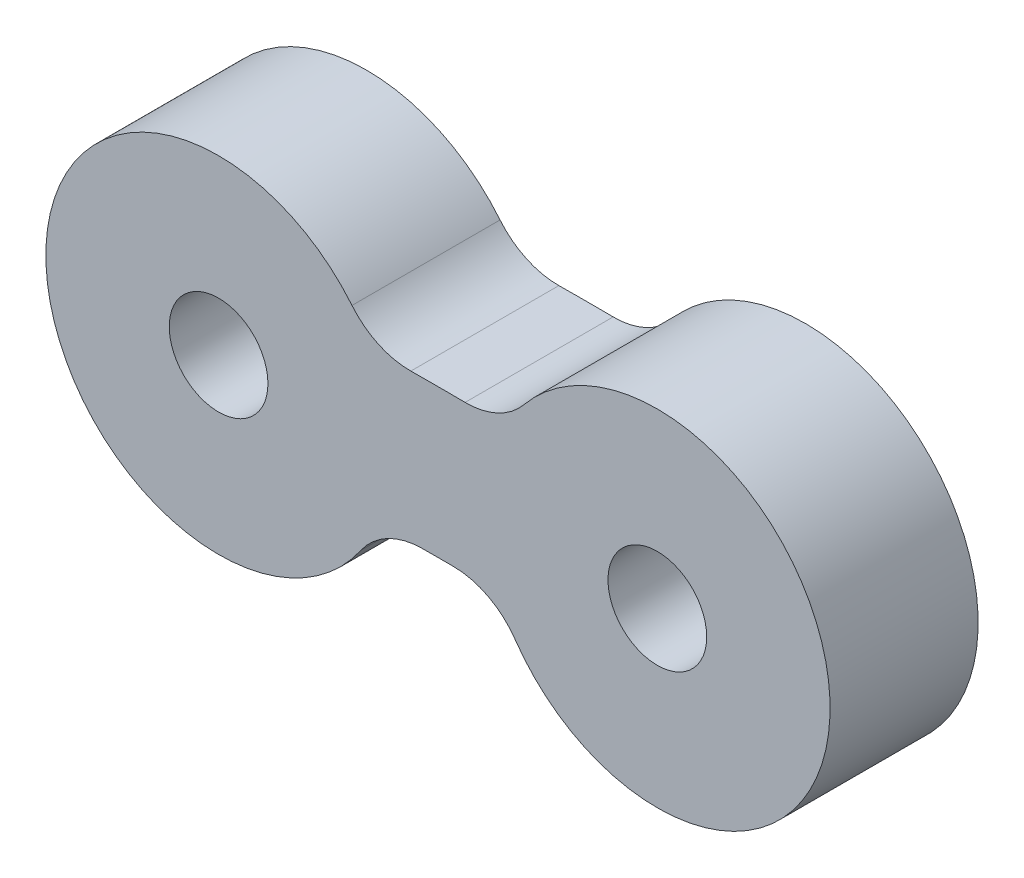
ISO-10303-21;
HEADER;
FILE_DESCRIPTION(('STEP AP214'),'2;1');
FILE_NAME('part.step','',(''),(''),'','','');
FILE_SCHEMA(('AUTOMOTIVE_DESIGN { 1 0 10303 214 1 1 1 1 }'));
ENDSEC;
DATA;
#1=APPLICATION_CONTEXT('core data for automotive mechanical design processes');
#2=APPLICATION_PROTOCOL_DEFINITION('international standard','automotive_design',2000,#1);
#3=PRODUCT_CONTEXT('',#1,'mechanical');
#4=PRODUCT('Part','Part','',(#3));
#5=PRODUCT_RELATED_PRODUCT_CATEGORY('part','',(#4));
#6=PRODUCT_DEFINITION_FORMATION('','',#4);
#7=PRODUCT_DEFINITION_CONTEXT('part definition',#1,'design');
#8=PRODUCT_DEFINITION('design','',#6,#7);
#9=PRODUCT_DEFINITION_SHAPE('','',#8);
#10=(LENGTH_UNIT() NAMED_UNIT(*) SI_UNIT(.MILLI.,.METRE.));
#11=(NAMED_UNIT(*) PLANE_ANGLE_UNIT() SI_UNIT($,.RADIAN.));
#12=(NAMED_UNIT(*) SI_UNIT($,.STERADIAN.) SOLID_ANGLE_UNIT());
#13=UNCERTAINTY_MEASURE_WITH_UNIT(LENGTH_MEASURE(1.E-05),#10,'distance_accuracy_value','');
#14=(GEOMETRIC_REPRESENTATION_CONTEXT(3) GLOBAL_UNCERTAINTY_ASSIGNED_CONTEXT((#13)) GLOBAL_UNIT_ASSIGNED_CONTEXT((#10,
#11,#12)) REPRESENTATION_CONTEXT('',''));
#15=CARTESIAN_POINT('',(0.,0.,0.));
#16=DIRECTION('',(0.,0.,1.));
#17=DIRECTION('',(1.,0.,0.));
#18=AXIS2_PLACEMENT_3D('',#15,#16,#17);
#19=CARTESIAN_POINT('',(-4.445,-1.66988088377663,3.));
#20=DIRECTION('',(0.,0.,-1.));
#21=DIRECTION('',(-1.,0.,0.));
#22=AXIS2_PLACEMENT_3D('',#19,#20,#21);
#23=CYLINDRICAL_SURFACE('',#22,3.5);
#24=CARTESIAN_POINT('',(-4.445,-1.66988088377663,0.));
#25=DIRECTION('',(0.,0.,1.));
#26=DIRECTION('',(1.,0.,0.));
#27=AXIS2_PLACEMENT_3D('',#24,#25,#26);
#28=CIRCLE('',#27,3.5);
#29=CARTESIAN_POINT('',(-1.56460341237539,-3.65817550429958,0.));
#30=VERTEX_POINT('',#29);
#31=CARTESIAN_POINT('',(-1.74171768664517,0.553239611001595,0.));
#32=VERTEX_POINT('',#31);
#33=EDGE_CURVE('E163',#30,#32,#28,.F.);
#34=ORIENTED_EDGE('',*,*,#33,.F.);
#35=DIRECTION('',(0.,0.,-1.));
#36=VECTOR('',#35,1.);
#37=CARTESIAN_POINT('',(-1.56460341237539,-3.65817550429958,3.));
#38=LINE('',#37,#36);
#39=CARTESIAN_POINT('',(-1.56460341237539,-3.65817550429958,3.));
#40=VERTEX_POINT('',#39);
#41=EDGE_CURVE('E150',#30,#40,#38,.F.);
#42=ORIENTED_EDGE('',*,*,#41,.T.);
#43=CARTESIAN_POINT('',(-4.445,-1.66988088377663,3.));
#44=DIRECTION('',(0.,0.,1.));
#45=DIRECTION('',(1.,0.,0.));
#46=AXIS2_PLACEMENT_3D('',#43,#44,#45);
#47=CIRCLE('',#46,3.5);
#48=CARTESIAN_POINT('',(-1.74171768664517,0.553239611001595,3.));
#49=VERTEX_POINT('',#48);
#50=EDGE_CURVE('E167',#40,#49,#47,.F.);
#51=ORIENTED_EDGE('',*,*,#50,.T.);
#52=DIRECTION('',(0.,0.,-1.));
#53=VECTOR('',#52,1.);
#54=CARTESIAN_POINT('',(-1.74171768664517,0.553239611001594,3.));
#55=LINE('',#54,#53);
#56=EDGE_CURVE('E144',#49,#32,#55,.T.);
#57=ORIENTED_EDGE('',*,*,#56,.T.);
#58=EDGE_LOOP('',(#34,#42,#51,#57));
#59=FACE_BOUND('',#58,.T.);
#60=ADVANCED_FACE('F42',(#59),#23,.T.);
#61=CARTESIAN_POINT('',(0.,-56.4381834911071,3.));
#62=DIRECTION('',(0.,0.,-1.));
#63=DIRECTION('',(-1.,0.,0.));
#64=AXIS2_PLACEMENT_3D('',#61,#62,#63);
#65=CYLINDRICAL_SURFACE('',#64,53.4391756259318);
#66=CARTESIAN_POINT('',(0.,-56.4381834911071,0.));
#67=DIRECTION('',(0.,0.,1.));
#68=DIRECTION('',(1.,0.,0.));
#69=AXIS2_PLACEMENT_3D('',#66,#67,#68);
#70=CIRCLE('',#69,53.4391756259318);
#71=CARTESIAN_POINT('',(-0.319508308090178,-2.99996303027727,0.));
#72=VERTEX_POINT('',#71);
#73=CARTESIAN_POINT('',(0.319508308090182,-2.99996303027727,0.));
#74=VERTEX_POINT('',#73);
#75=EDGE_CURVE('E126',#72,#74,#70,.F.);
#76=ORIENTED_EDGE('',*,*,#75,.T.);
#77=DIRECTION('',(0.,0.,-1.));
#78=VECTOR('',#77,1.);
#79=CARTESIAN_POINT('',(0.319508308090182,-2.99996303027727,3.));
#80=LINE('',#79,#78);
#81=CARTESIAN_POINT('',(0.319508308090182,-2.99996303027727,3.));
#82=VERTEX_POINT('',#81);
#83=EDGE_CURVE('E145',#74,#82,#80,.F.);
#84=ORIENTED_EDGE('',*,*,#83,.T.);
#85=CARTESIAN_POINT('',(0.,-56.4381834911071,3.));
#86=DIRECTION('',(0.,0.,1.));
#87=DIRECTION('',(1.,0.,0.));
#88=AXIS2_PLACEMENT_3D('',#85,#86,#87);
#89=CIRCLE('',#88,53.4391756259318);
#90=CARTESIAN_POINT('',(-0.319508308090178,-2.99996303027727,3.));
#91=VERTEX_POINT('',#90);
#92=EDGE_CURVE('E172',#91,#82,#89,.F.);
#93=ORIENTED_EDGE('',*,*,#92,.F.);
#94=DIRECTION('',(0.,0.,-1.));
#95=VECTOR('',#94,1.);
#96=CARTESIAN_POINT('',(-0.319508308090178,-2.99996303027727,3.));
#97=LINE('',#96,#95);
#98=EDGE_CURVE('E132',#91,#72,#97,.T.);
#99=ORIENTED_EDGE('',*,*,#98,.T.);
#100=EDGE_LOOP('',(#76,#84,#93,#99));
#101=FACE_BOUND('',#100,.T.);
#102=ADVANCED_FACE('F191',(#101),#65,.F.);
#103=CARTESIAN_POINT('',(4.445,-1.66988088377663,3.));
#104=DIRECTION('',(0.,0.,-1.));
#105=DIRECTION('',(-1.,0.,0.));
#106=AXIS2_PLACEMENT_3D('',#103,#104,#105);
#107=CYLINDRICAL_SURFACE('',#106,3.5);
#108=CARTESIAN_POINT('',(4.445,-1.66988088377663,3.));
#109=DIRECTION('',(0.,0.,1.));
#110=DIRECTION('',(1.,0.,0.));
#111=AXIS2_PLACEMENT_3D('',#108,#109,#110);
#112=CIRCLE('',#111,3.5);
#113=CARTESIAN_POINT('',(1.74171768664517,0.55323961100159,3.));
#114=VERTEX_POINT('',#113);
#115=CARTESIAN_POINT('',(1.56460341237539,-3.65817550429958,3.));
#116=VERTEX_POINT('',#115);
#117=EDGE_CURVE('E138',#114,#116,#112,.F.);
#118=ORIENTED_EDGE('',*,*,#117,.T.);
#119=DIRECTION('',(0.,0.,-1.));
#120=VECTOR('',#119,1.);
#121=CARTESIAN_POINT('',(1.56460341237539,-3.65817550429958,3.));
#122=LINE('',#121,#120);
#123=CARTESIAN_POINT('',(1.56460341237539,-3.65817550429958,0.));
#124=VERTEX_POINT('',#123);
#125=EDGE_CURVE('E129',#116,#124,#122,.T.);
#126=ORIENTED_EDGE('',*,*,#125,.T.);
#127=CARTESIAN_POINT('',(4.445,-1.66988088377663,0.));
#128=DIRECTION('',(0.,0.,1.));
#129=DIRECTION('',(1.,0.,0.));
#130=AXIS2_PLACEMENT_3D('',#127,#128,#129);
#131=CIRCLE('',#130,3.5);
#132=CARTESIAN_POINT('',(1.74171768664517,0.55323961100159,0.));
#133=VERTEX_POINT('',#132);
#134=EDGE_CURVE('E112',#133,#124,#131,.F.);
#135=ORIENTED_EDGE('',*,*,#134,.F.);
#136=DIRECTION('',(0.,0.,-1.));
#137=VECTOR('',#136,1.);
#138=CARTESIAN_POINT('',(1.74171768664517,0.553239611001591,3.));
#139=LINE('',#138,#137);
#140=EDGE_CURVE('E127',#133,#114,#139,.F.);
#141=ORIENTED_EDGE('',*,*,#140,.T.);
#142=EDGE_LOOP('',(#118,#126,#135,#141));
#143=FACE_BOUND('',#142,.T.);
#144=ADVANCED_FACE('F123',(#143),#107,.T.);
#145=CARTESIAN_POINT('',(4.445,-1.66988088377663,3.));
#146=DIRECTION('',(0.,0.,-1.));
#147=DIRECTION('',(-1.,0.,0.));
#148=AXIS2_PLACEMENT_3D('',#145,#146,#147);
#149=CYLINDRICAL_SURFACE('',#148,1.);
#150=CARTESIAN_POINT('',(4.445,-1.66988088377663,3.));
#151=DIRECTION('',(0.,0.,1.));
#152=DIRECTION('',(1.,0.,0.));
#153=AXIS2_PLACEMENT_3D('',#150,#151,#152);
#154=CIRCLE('',#153,1.);
#155=CARTESIAN_POINT('',(5.445,-1.66988088377663,3.));
#156=VERTEX_POINT('',#155);
#157=EDGE_CURVE('E174',#156,#156,#154,.T.);
#158=ORIENTED_EDGE('',*,*,#157,.T.);
#159=EDGE_LOOP('',(#158));
#160=FACE_BOUND('',#159,.T.);
#161=CARTESIAN_POINT('',(4.445,-1.66988088377663,0.));
#162=DIRECTION('',(0.,0.,1.));
#163=DIRECTION('',(1.,0.,0.));
#164=AXIS2_PLACEMENT_3D('',#161,#162,#163);
#165=CIRCLE('',#164,1.);
#166=CARTESIAN_POINT('',(5.445,-1.66988088377663,0.));
#167=VERTEX_POINT('',#166);
#168=EDGE_CURVE('E190',#167,#167,#165,.T.);
#169=ORIENTED_EDGE('',*,*,#168,.F.);
#170=EDGE_LOOP('',(#169));
#171=FACE_BOUND('',#170,.T.);
#172=ADVANCED_FACE('F216',(#160,#171),#149,.F.);
#173=CARTESIAN_POINT('',(-4.445,-1.66988088377663,3.));
#174=DIRECTION('',(0.,0.,-1.));
#175=DIRECTION('',(-1.,0.,0.));
#176=AXIS2_PLACEMENT_3D('',#173,#174,#175);
#177=CYLINDRICAL_SURFACE('',#176,1.);
#178=CARTESIAN_POINT('',(-4.445,-1.66988088377663,3.));
#179=DIRECTION('',(0.,0.,1.));
#180=DIRECTION('',(1.,0.,0.));
#181=AXIS2_PLACEMENT_3D('',#178,#179,#180);
#182=CIRCLE('',#181,1.);
#183=CARTESIAN_POINT('',(-3.445,-1.66988088377663,3.));
#184=VERTEX_POINT('',#183);
#185=EDGE_CURVE('E164',#184,#184,#182,.T.);
#186=ORIENTED_EDGE('',*,*,#185,.T.);
#187=EDGE_LOOP('',(#186));
#188=FACE_BOUND('',#187,.T.);
#189=CARTESIAN_POINT('',(-4.445,-1.66988088377663,0.));
#190=DIRECTION('',(0.,0.,1.));
#191=DIRECTION('',(1.,0.,0.));
#192=AXIS2_PLACEMENT_3D('',#189,#190,#191);
#193=CIRCLE('',#192,1.);
#194=CARTESIAN_POINT('',(-3.445,-1.66988088377663,0.));
#195=VERTEX_POINT('',#194);
#196=EDGE_CURVE('E183',#195,#195,#193,.T.);
#197=ORIENTED_EDGE('',*,*,#196,.F.);
#198=EDGE_LOOP('',(#197));
#199=FACE_BOUND('',#198,.T.);
#200=ADVANCED_FACE('F223',(#188,#199),#177,.F.);
#201=CARTESIAN_POINT('',(0.,-56.4381834911071,3.));
#202=DIRECTION('',(0.,0.,-1.));
#203=DIRECTION('',(-1.,0.,0.));
#204=AXIS2_PLACEMENT_3D('',#201,#202,#203);
#205=CYLINDRICAL_SURFACE('',#204,56.4381834911071);
#206=CARTESIAN_POINT('',(0.,-56.4381834911071,3.));
#207=DIRECTION('',(0.,0.,1.));
#208=DIRECTION('',(1.,0.,0.));
#209=AXIS2_PLACEMENT_3D('',#206,#207,#208);
#210=CIRCLE('',#209,56.4381834911071);
#211=CARTESIAN_POINT('',(-0.54978547617829,-0.00267789661403256,3.));
#212=VERTEX_POINT('',#211);
#213=CARTESIAN_POINT('',(0.549785476178289,-0.00267789661403256,3.));
#214=VERTEX_POINT('',#213);
#215=EDGE_CURVE('E135',#212,#214,#210,.F.);
#216=ORIENTED_EDGE('',*,*,#215,.T.);
#217=DIRECTION('',(0.,0.,-1.));
#218=VECTOR('',#217,1.);
#219=CARTESIAN_POINT('',(0.549785476178289,-0.00267789661402562,3.));
#220=LINE('',#219,#218);
#221=CARTESIAN_POINT('',(0.549785476178289,-0.00267789661403256,0.));
#222=VERTEX_POINT('',#221);
#223=EDGE_CURVE('E148',#214,#222,#220,.T.);
#224=ORIENTED_EDGE('',*,*,#223,.T.);
#225=CARTESIAN_POINT('',(0.,-56.4381834911071,0.));
#226=DIRECTION('',(0.,0.,1.));
#227=DIRECTION('',(1.,0.,0.));
#228=AXIS2_PLACEMENT_3D('',#225,#226,#227);
#229=CIRCLE('',#228,56.4381834911071);
#230=CARTESIAN_POINT('',(-0.54978547617829,-0.00267789661403256,0.));
#231=VERTEX_POINT('',#230);
#232=EDGE_CURVE('E114',#231,#222,#229,.F.);
#233=ORIENTED_EDGE('',*,*,#232,.F.);
#234=DIRECTION('',(0.,0.,-1.));
#235=VECTOR('',#234,1.);
#236=CARTESIAN_POINT('',(-0.54978547617829,-0.00267789661402562,3.));
#237=LINE('',#236,#235);
#238=EDGE_CURVE('E68',#231,#212,#237,.F.);
#239=ORIENTED_EDGE('',*,*,#238,.T.);
#240=EDGE_LOOP('',(#216,#224,#233,#239));
#241=FACE_BOUND('',#240,.T.);
#242=ADVANCED_FACE('F165',(#241),#205,.T.);
#243=CARTESIAN_POINT('',(0.,0.,3.));
#244=DIRECTION('',(0.,0.,1.));
#245=DIRECTION('',(1.,0.,0.));
#246=AXIS2_PLACEMENT_3D('',#243,#244,#245);
#247=PLANE('',#246);
#248=ORIENTED_EDGE('',*,*,#185,.F.);
#249=EDGE_LOOP('',(#248));
#250=FACE_BOUND('',#249,.T.);
#251=ORIENTED_EDGE('',*,*,#157,.F.);
#252=EDGE_LOOP('',(#251));
#253=FACE_BOUND('',#252,.T.);
#254=ORIENTED_EDGE('',*,*,#50,.F.);
#255=CARTESIAN_POINT('',(-0.310396441078271,-4.523935790493,3.));
#256=DIRECTION('',(0.,0.,1.));
#257=DIRECTION('',(1.,0.,0.));
#258=AXIS2_PLACEMENT_3D('',#255,#256,#257);
#259=CIRCLE('',#258,1.524);
#260=EDGE_CURVE('E119',#40,#91,#259,.F.);
#261=ORIENTED_EDGE('',*,*,#260,.T.);
#262=ORIENTED_EDGE('',*,*,#92,.T.);
#263=CARTESIAN_POINT('',(0.310396441078275,-4.523935790493,3.));
#264=DIRECTION('',(0.,0.,1.));
#265=DIRECTION('',(1.,0.,0.));
#266=AXIS2_PLACEMENT_3D('',#263,#264,#265);
#267=CIRCLE('',#266,1.524);
#268=EDGE_CURVE('E152',#82,#116,#267,.F.);
#269=ORIENTED_EDGE('',*,*,#268,.T.);
#270=ORIENTED_EDGE('',*,*,#117,.F.);
#271=CARTESIAN_POINT('',(0.564631330772948,1.52124979215645,3.));
#272=DIRECTION('',(0.,0.,1.));
#273=DIRECTION('',(1.,0.,0.));
#274=AXIS2_PLACEMENT_3D('',#271,#272,#273);
#275=CIRCLE('',#274,1.524);
#276=EDGE_CURVE('E56',#114,#214,#275,.F.);
#277=ORIENTED_EDGE('',*,*,#276,.T.);
#278=ORIENTED_EDGE('',*,*,#215,.F.);
#279=CARTESIAN_POINT('',(-0.56463133077295,1.52124979215645,3.));
#280=DIRECTION('',(0.,0.,1.));
#281=DIRECTION('',(1.,0.,0.));
#282=AXIS2_PLACEMENT_3D('',#279,#280,#281);
#283=CIRCLE('',#282,1.524);
#284=EDGE_CURVE('E12',#212,#49,#283,.F.);
#285=ORIENTED_EDGE('',*,*,#284,.T.);
#286=EDGE_LOOP('',(#254,#261,#262,#269,#270,#277,#278,#285));
#287=FACE_BOUND('',#286,.T.);
#288=ADVANCED_FACE('F169',(#250,#253,#287),#247,.T.);
#289=CARTESIAN_POINT('',(0.,0.,0.));
#290=DIRECTION('',(0.,0.,1.));
#291=DIRECTION('',(1.,0.,0.));
#292=AXIS2_PLACEMENT_3D('',#289,#290,#291);
#293=PLANE('',#292);
#294=ORIENTED_EDGE('',*,*,#196,.T.);
#295=EDGE_LOOP('',(#294));
#296=FACE_BOUND('',#295,.T.);
#297=ORIENTED_EDGE('',*,*,#168,.T.);
#298=EDGE_LOOP('',(#297));
#299=FACE_BOUND('',#298,.T.);
#300=ORIENTED_EDGE('',*,*,#75,.F.);
#301=CARTESIAN_POINT('',(-0.310396441078271,-4.523935790493,0.));
#302=DIRECTION('',(0.,0.,1.));
#303=DIRECTION('',(1.,0.,0.));
#304=AXIS2_PLACEMENT_3D('',#301,#302,#303);
#305=CIRCLE('',#304,1.524);
#306=EDGE_CURVE('E158',#72,#30,#305,.T.);
#307=ORIENTED_EDGE('',*,*,#306,.T.);
#308=ORIENTED_EDGE('',*,*,#33,.T.);
#309=CARTESIAN_POINT('',(-0.56463133077295,1.52124979215645,0.));
#310=DIRECTION('',(0.,0.,1.));
#311=DIRECTION('',(1.,0.,0.));
#312=AXIS2_PLACEMENT_3D('',#309,#310,#311);
#313=CIRCLE('',#312,1.524);
#314=EDGE_CURVE('E55',#32,#231,#313,.T.);
#315=ORIENTED_EDGE('',*,*,#314,.T.);
#316=ORIENTED_EDGE('',*,*,#232,.T.);
#317=CARTESIAN_POINT('',(0.564631330772948,1.52124979215645,0.));
#318=DIRECTION('',(0.,0.,1.));
#319=DIRECTION('',(1.,0.,0.));
#320=AXIS2_PLACEMENT_3D('',#317,#318,#319);
#321=CIRCLE('',#320,1.524);
#322=EDGE_CURVE('E109',#222,#133,#321,.T.);
#323=ORIENTED_EDGE('',*,*,#322,.T.);
#324=ORIENTED_EDGE('',*,*,#134,.T.);
#325=CARTESIAN_POINT('',(0.310396441078275,-4.523935790493,0.));
#326=DIRECTION('',(0.,0.,1.));
#327=DIRECTION('',(1.,0.,0.));
#328=AXIS2_PLACEMENT_3D('',#325,#326,#327);
#329=CIRCLE('',#328,1.524);
#330=EDGE_CURVE('E155',#124,#74,#329,.T.);
#331=ORIENTED_EDGE('',*,*,#330,.T.);
#332=EDGE_LOOP('',(#300,#307,#308,#315,#316,#323,#324,#331));
#333=FACE_BOUND('',#332,.T.);
#334=ADVANCED_FACE('F113',(#296,#299,#333),#293,.F.);
#335=CARTESIAN_POINT('',(0.310396441078275,-4.523935790493,3.));
#336=DIRECTION('',(0.,0.,-1.));
#337=DIRECTION('',(-1.,0.,0.));
#338=AXIS2_PLACEMENT_3D('',#335,#336,#337);
#339=CYLINDRICAL_SURFACE('',#338,1.524);
#340=ORIENTED_EDGE('',*,*,#268,.F.);
#341=ORIENTED_EDGE('',*,*,#83,.F.);
#342=ORIENTED_EDGE('',*,*,#330,.F.);
#343=ORIENTED_EDGE('',*,*,#125,.F.);
#344=EDGE_LOOP('',(#340,#341,#342,#343));
#345=FACE_BOUND('',#344,.T.);
#346=ADVANCED_FACE('F197',(#345),#339,.F.);
#347=CARTESIAN_POINT('',(-0.310396441078271,-4.523935790493,3.));
#348=DIRECTION('',(0.,0.,-1.));
#349=DIRECTION('',(-1.,0.,0.));
#350=AXIS2_PLACEMENT_3D('',#347,#348,#349);
#351=CYLINDRICAL_SURFACE('',#350,1.524);
#352=ORIENTED_EDGE('',*,*,#260,.F.);
#353=ORIENTED_EDGE('',*,*,#41,.F.);
#354=ORIENTED_EDGE('',*,*,#306,.F.);
#355=ORIENTED_EDGE('',*,*,#98,.F.);
#356=EDGE_LOOP('',(#352,#353,#354,#355));
#357=FACE_BOUND('',#356,.T.);
#358=ADVANCED_FACE('F203',(#357),#351,.F.);
#359=CARTESIAN_POINT('',(0.564631330772948,1.52124979215645,3.));
#360=DIRECTION('',(0.,0.,1.));
#361=DIRECTION('',(1.,0.,0.));
#362=AXIS2_PLACEMENT_3D('',#359,#360,#361);
#363=CYLINDRICAL_SURFACE('',#362,1.524);
#364=ORIENTED_EDGE('',*,*,#276,.F.);
#365=ORIENTED_EDGE('',*,*,#140,.F.);
#366=ORIENTED_EDGE('',*,*,#322,.F.);
#367=ORIENTED_EDGE('',*,*,#223,.F.);
#368=EDGE_LOOP('',(#364,#365,#366,#367));
#369=FACE_BOUND('',#368,.T.);
#370=ADVANCED_FACE('F133',(#369),#363,.F.);
#371=CARTESIAN_POINT('',(-0.56463133077295,1.52124979215645,3.));
#372=DIRECTION('',(0.,0.,1.));
#373=DIRECTION('',(1.,0.,0.));
#374=AXIS2_PLACEMENT_3D('',#371,#372,#373);
#375=CYLINDRICAL_SURFACE('',#374,1.524);
#376=ORIENTED_EDGE('',*,*,#284,.F.);
#377=ORIENTED_EDGE('',*,*,#238,.F.);
#378=ORIENTED_EDGE('',*,*,#314,.F.);
#379=ORIENTED_EDGE('',*,*,#56,.F.);
#380=EDGE_LOOP('',(#376,#377,#378,#379));
#381=FACE_BOUND('',#380,.T.);
#382=ADVANCED_FACE('F46',(#381),#375,.F.);
#383=CLOSED_SHELL('',(#60,#102,#144,#172,#200,#242,#288,#334,#346,#358,#370,#382));
#384=MANIFOLD_SOLID_BREP('B2',#383);
#385=ADVANCED_BREP_SHAPE_REPRESENTATION('',(#18,#384),#14);
#386=SHAPE_DEFINITION_REPRESENTATION(#9,#385);
ENDSEC;
END-ISO-10303-21;
